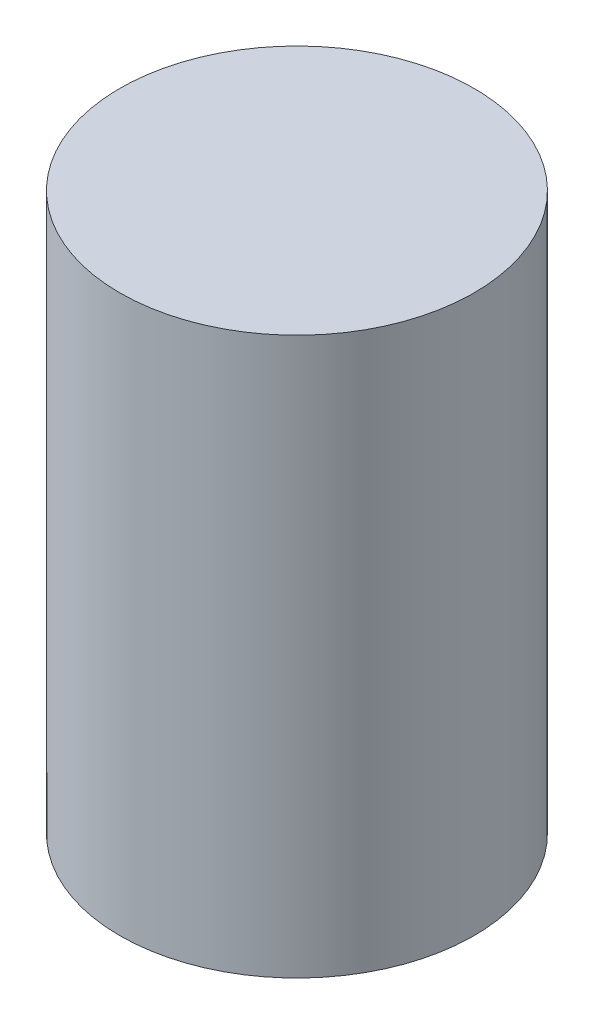
ISO-10303-21;
HEADER;
FILE_DESCRIPTION(('STEP AP214'),'2;1');
FILE_NAME('part.step','',(''),(''),'','','');
FILE_SCHEMA(('AUTOMOTIVE_DESIGN { 1 0 10303 214 1 1 1 1 }'));
ENDSEC;
DATA;
#1=APPLICATION_CONTEXT('core data for automotive mechanical design processes');
#2=APPLICATION_PROTOCOL_DEFINITION('international standard','automotive_design',2000,#1);
#3=PRODUCT_CONTEXT('',#1,'mechanical');
#4=PRODUCT('Part','Part','',(#3));
#5=PRODUCT_RELATED_PRODUCT_CATEGORY('part','',(#4));
#6=PRODUCT_DEFINITION_FORMATION('','',#4);
#7=PRODUCT_DEFINITION_CONTEXT('part definition',#1,'design');
#8=PRODUCT_DEFINITION('design','',#6,#7);
#9=PRODUCT_DEFINITION_SHAPE('','',#8);
#10=(LENGTH_UNIT() NAMED_UNIT(*) SI_UNIT(.MILLI.,.METRE.));
#11=(NAMED_UNIT(*) PLANE_ANGLE_UNIT() SI_UNIT($,.RADIAN.));
#12=(NAMED_UNIT(*) SI_UNIT($,.STERADIAN.) SOLID_ANGLE_UNIT());
#13=UNCERTAINTY_MEASURE_WITH_UNIT(LENGTH_MEASURE(1.E-05),#10,'distance_accuracy_value','');
#14=(GEOMETRIC_REPRESENTATION_CONTEXT(3) GLOBAL_UNCERTAINTY_ASSIGNED_CONTEXT((#13)) GLOBAL_UNIT_ASSIGNED_CONTEXT((#10,
#11,#12)) REPRESENTATION_CONTEXT('',''));
#15=CARTESIAN_POINT('',(0.,0.,0.));
#16=DIRECTION('',(0.,0.,1.));
#17=DIRECTION('',(1.,0.,0.));
#18=AXIS2_PLACEMENT_3D('',#15,#16,#17);
#19=CARTESIAN_POINT('',(0.,55.,0.));
#20=DIRECTION('',(0.,-1.,0.));
#21=DIRECTION('',(0.,0.,-1.));
#22=AXIS2_PLACEMENT_3D('',#19,#20,#21);
#23=CYLINDRICAL_SURFACE('',#22,17.5);
#24=CARTESIAN_POINT('',(0.,55.,0.));
#25=DIRECTION('',(0.,1.,0.));
#26=DIRECTION('',(0.,0.,1.));
#27=AXIS2_PLACEMENT_3D('',#24,#25,#26);
#28=CIRCLE('',#27,17.5);
#29=CARTESIAN_POINT('',(0.,55.,17.5));
#30=VERTEX_POINT('',#29);
#31=EDGE_CURVE('E10',#30,#30,#28,.T.);
#32=ORIENTED_EDGE('',*,*,#31,.F.);
#33=EDGE_LOOP('',(#32));
#34=FACE_BOUND('',#33,.T.);
#35=CARTESIAN_POINT('',(0.,0.,0.));
#36=DIRECTION('',(0.,1.,0.));
#37=DIRECTION('',(0.,0.,1.));
#38=AXIS2_PLACEMENT_3D('',#35,#36,#37);
#39=CIRCLE('',#38,17.5);
#40=CARTESIAN_POINT('',(0.,0.,17.5));
#41=VERTEX_POINT('',#40);
#42=EDGE_CURVE('E37',#41,#41,#39,.T.);
#43=ORIENTED_EDGE('',*,*,#42,.T.);
#44=EDGE_LOOP('',(#43));
#45=FACE_BOUND('',#44,.T.);
#46=ADVANCED_FACE('F34',(#34,#45),#23,.T.);
#47=CARTESIAN_POINT('',(0.,55.,0.));
#48=DIRECTION('',(0.,1.,0.));
#49=DIRECTION('',(0.,0.,1.));
#50=AXIS2_PLACEMENT_3D('',#47,#48,#49);
#51=PLANE('',#50);
#52=ORIENTED_EDGE('',*,*,#31,.T.);
#53=EDGE_LOOP('',(#52));
#54=FACE_BOUND('',#53,.T.);
#55=ADVANCED_FACE('F49',(#54),#51,.T.);
#56=CARTESIAN_POINT('',(0.,0.,0.));
#57=DIRECTION('',(0.,1.,0.));
#58=DIRECTION('',(0.,0.,1.));
#59=AXIS2_PLACEMENT_3D('',#56,#57,#58);
#60=PLANE('',#59);
#61=ORIENTED_EDGE('',*,*,#42,.F.);
#62=EDGE_LOOP('',(#61));
#63=FACE_BOUND('',#62,.T.);
#64=ADVANCED_FACE('F47',(#63),#60,.F.);
#65=CLOSED_SHELL('',(#46,#55,#64));
#66=MANIFOLD_SOLID_BREP('B2',#65);
#67=ADVANCED_BREP_SHAPE_REPRESENTATION('',(#18,#66),#14);
#68=SHAPE_DEFINITION_REPRESENTATION(#9,#67);
ENDSEC;
END-ISO-10303-21;
